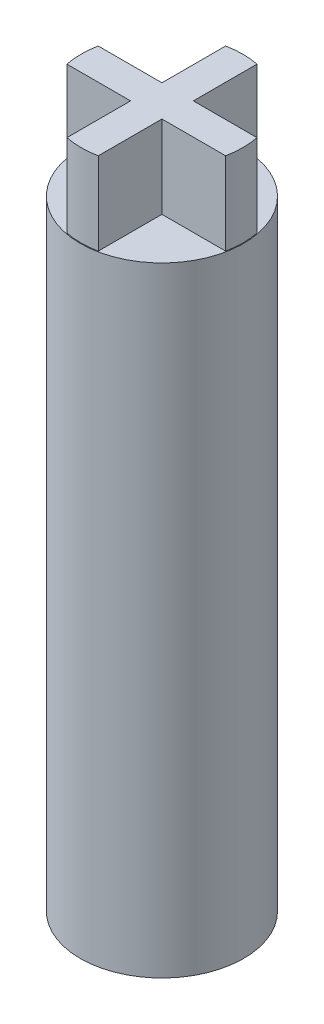
ISO-10303-21;
HEADER;
FILE_DESCRIPTION(('STEP AP214'),'2;1');
FILE_NAME('part.step','',(''),(''),'','','');
FILE_SCHEMA(('AUTOMOTIVE_DESIGN { 1 0 10303 214 1 1 1 1 }'));
ENDSEC;
DATA;
#1=APPLICATION_CONTEXT('core data for automotive mechanical design processes');
#2=APPLICATION_PROTOCOL_DEFINITION('international standard','automotive_design',2000,#1);
#3=PRODUCT_CONTEXT('',#1,'mechanical');
#4=PRODUCT('Part','Part','',(#3));
#5=PRODUCT_RELATED_PRODUCT_CATEGORY('part','',(#4));
#6=PRODUCT_DEFINITION_FORMATION('','',#4);
#7=PRODUCT_DEFINITION_CONTEXT('part definition',#1,'design');
#8=PRODUCT_DEFINITION('design','',#6,#7);
#9=PRODUCT_DEFINITION_SHAPE('','',#8);
#10=(LENGTH_UNIT() NAMED_UNIT(*) SI_UNIT(.MILLI.,.METRE.));
#11=(NAMED_UNIT(*) PLANE_ANGLE_UNIT() SI_UNIT($,.RADIAN.));
#12=(NAMED_UNIT(*) SI_UNIT($,.STERADIAN.) SOLID_ANGLE_UNIT());
#13=UNCERTAINTY_MEASURE_WITH_UNIT(LENGTH_MEASURE(1.E-05),#10,'distance_accuracy_value','');
#14=(GEOMETRIC_REPRESENTATION_CONTEXT(3) GLOBAL_UNCERTAINTY_ASSIGNED_CONTEXT((#13)) GLOBAL_UNIT_ASSIGNED_CONTEXT((#10,
#11,#12)) REPRESENTATION_CONTEXT('',''));
#15=CARTESIAN_POINT('',(0.,0.,0.));
#16=DIRECTION('',(0.,0.,1.));
#17=DIRECTION('',(1.,0.,0.));
#18=AXIS2_PLACEMENT_3D('',#15,#16,#17);
#19=CARTESIAN_POINT('',(0.,-75.,0.));
#20=DIRECTION('',(0.,1.,0.));
#21=DIRECTION('',(0.,0.,1.));
#22=AXIS2_PLACEMENT_3D('',#19,#20,#21);
#23=CYLINDRICAL_SURFACE('',#22,9.9);
#24=CARTESIAN_POINT('',(0.,-75.,0.));
#25=DIRECTION('',(0.,1.,0.));
#26=DIRECTION('',(0.,0.,1.));
#27=AXIS2_PLACEMENT_3D('',#24,#25,#26);
#28=CIRCLE('',#27,9.9);
#29=CARTESIAN_POINT('',(0.,-75.,9.9));
#30=VERTEX_POINT('',#29);
#31=EDGE_CURVE('E11',#30,#30,#28,.T.);
#32=ORIENTED_EDGE('',*,*,#31,.T.);
#33=EDGE_LOOP('',(#32));
#34=FACE_BOUND('',#33,.T.);
#35=CARTESIAN_POINT('',(0.,0.,0.));
#36=DIRECTION('',(0.,1.,0.));
#37=DIRECTION('',(0.,0.,1.));
#38=AXIS2_PLACEMENT_3D('',#35,#36,#37);
#39=CIRCLE('',#38,9.9);
#40=CARTESIAN_POINT('',(0.,0.,9.9));
#41=VERTEX_POINT('',#40);
#42=EDGE_CURVE('E44',#41,#41,#39,.T.);
#43=ORIENTED_EDGE('',*,*,#42,.F.);
#44=EDGE_LOOP('',(#43));
#45=FACE_BOUND('',#44,.T.);
#46=ADVANCED_FACE('F41',(#34,#45),#23,.T.);
#47=CARTESIAN_POINT('',(0.,-75.,0.));
#48=DIRECTION('',(0.,1.,0.));
#49=DIRECTION('',(0.,0.,1.));
#50=AXIS2_PLACEMENT_3D('',#47,#48,#49);
#51=PLANE('',#50);
#52=CARTESIAN_POINT('',(0.,-75.,0.));
#53=DIRECTION('',(0.,-1.,0.));
#54=DIRECTION('',(0.,0.,-1.));
#55=AXIS2_PLACEMENT_3D('',#52,#53,#54);
#56=CIRCLE('',#55,4.7);
#57=CARTESIAN_POINT('',(0.,-75.,-4.7));
#58=VERTEX_POINT('',#57);
#59=EDGE_CURVE('E258',#58,#58,#56,.T.);
#60=ORIENTED_EDGE('',*,*,#59,.F.);
#61=EDGE_LOOP('',(#60));
#62=FACE_BOUND('',#61,.T.);
#63=ORIENTED_EDGE('',*,*,#31,.F.);
#64=EDGE_LOOP('',(#63));
#65=FACE_BOUND('',#64,.T.);
#66=ADVANCED_FACE('F361',(#62,#65),#51,.F.);
#67=CARTESIAN_POINT('',(0.,0.,0.));
#68=DIRECTION('',(0.,1.,0.));
#69=DIRECTION('',(0.,0.,1.));
#70=AXIS2_PLACEMENT_3D('',#67,#68,#69);
#71=PLANE('',#70);
#72=ORIENTED_EDGE('',*,*,#42,.T.);
#73=EDGE_LOOP('',(#72));
#74=FACE_BOUND('',#73,.T.);
#75=CARTESIAN_POINT('',(0.,0.,0.));
#76=DIRECTION('',(0.,1.,0.));
#77=DIRECTION('',(0.,0.,1.));
#78=AXIS2_PLACEMENT_3D('',#75,#76,#77);
#79=CIRCLE('',#78,9.8);
#80=CARTESIAN_POINT('',(9.61405221537724,0.,1.89999999999999));
#81=VERTEX_POINT('',#80);
#82=CARTESIAN_POINT('',(9.61405221537724,0.,-1.90000000000001));
#83=VERTEX_POINT('',#82);
#84=EDGE_CURVE('E167',#81,#83,#79,.T.);
#85=ORIENTED_EDGE('',*,*,#84,.F.);
#86=DIRECTION('',(1.,0.,0.));
#87=VECTOR('',#86,1.);
#88=CARTESIAN_POINT('',(0.,0.,1.89999999999999));
#89=LINE('',#88,#87);
#90=CARTESIAN_POINT('',(1.9,0.,1.89999999999999));
#91=VERTEX_POINT('',#90);
#92=EDGE_CURVE('E155',#91,#81,#89,.T.);
#93=ORIENTED_EDGE('',*,*,#92,.F.);
#94=DIRECTION('',(0.,0.,1.));
#95=VECTOR('',#94,1.);
#96=CARTESIAN_POINT('',(1.9,0.,0.));
#97=LINE('',#96,#95);
#98=CARTESIAN_POINT('',(1.9,0.,9.61405221537724));
#99=VERTEX_POINT('',#98);
#100=EDGE_CURVE('E166',#91,#99,#97,.T.);
#101=ORIENTED_EDGE('',*,*,#100,.T.);
#102=CARTESIAN_POINT('',(0.,0.,0.));
#103=DIRECTION('',(0.,1.,0.));
#104=DIRECTION('',(0.,0.,1.));
#105=AXIS2_PLACEMENT_3D('',#102,#103,#104);
#106=CIRCLE('',#105,9.8);
#107=CARTESIAN_POINT('',(-1.9,0.,9.61405221537723));
#108=VERTEX_POINT('',#107);
#109=EDGE_CURVE('E188',#108,#99,#106,.T.);
#110=ORIENTED_EDGE('',*,*,#109,.F.);
#111=DIRECTION('',(0.,0.,1.));
#112=VECTOR('',#111,1.);
#113=CARTESIAN_POINT('',(-1.9,0.,0.));
#114=LINE('',#113,#112);
#115=CARTESIAN_POINT('',(-1.9,0.,1.89999999999999));
#116=VERTEX_POINT('',#115);
#117=EDGE_CURVE('E191',#116,#108,#114,.T.);
#118=ORIENTED_EDGE('',*,*,#117,.F.);
#119=DIRECTION('',(1.,0.,0.));
#120=VECTOR('',#119,1.);
#121=CARTESIAN_POINT('',(0.,0.,1.89999999999999));
#122=LINE('',#121,#120);
#123=CARTESIAN_POINT('',(-9.61405221537724,0.,1.89999999999999));
#124=VERTEX_POINT('',#123);
#125=EDGE_CURVE('E194',#124,#116,#122,.T.);
#126=ORIENTED_EDGE('',*,*,#125,.F.);
#127=CARTESIAN_POINT('',(0.,0.,0.));
#128=DIRECTION('',(0.,1.,0.));
#129=DIRECTION('',(0.,0.,1.));
#130=AXIS2_PLACEMENT_3D('',#127,#128,#129);
#131=CIRCLE('',#130,9.8);
#132=CARTESIAN_POINT('',(-9.61405221537724,0.,-1.90000000000001));
#133=VERTEX_POINT('',#132);
#134=EDGE_CURVE('E197',#133,#124,#131,.T.);
#135=ORIENTED_EDGE('',*,*,#134,.F.);
#136=DIRECTION('',(1.,0.,0.));
#137=VECTOR('',#136,1.);
#138=CARTESIAN_POINT('',(0.,0.,-1.90000000000001));
#139=LINE('',#138,#137);
#140=CARTESIAN_POINT('',(-1.9,0.,-1.90000000000001));
#141=VERTEX_POINT('',#140);
#142=EDGE_CURVE('E200',#133,#141,#139,.T.);
#143=ORIENTED_EDGE('',*,*,#142,.T.);
#144=DIRECTION('',(0.,0.,1.));
#145=VECTOR('',#144,1.);
#146=CARTESIAN_POINT('',(-1.9,0.,0.));
#147=LINE('',#146,#145);
#148=CARTESIAN_POINT('',(-1.9,0.,-9.61405221537724));
#149=VERTEX_POINT('',#148);
#150=EDGE_CURVE('E204',#149,#141,#147,.T.);
#151=ORIENTED_EDGE('',*,*,#150,.F.);
#152=CARTESIAN_POINT('',(0.,0.,0.));
#153=DIRECTION('',(0.,1.,0.));
#154=DIRECTION('',(0.,0.,1.));
#155=AXIS2_PLACEMENT_3D('',#152,#153,#154);
#156=CIRCLE('',#155,9.8);
#157=CARTESIAN_POINT('',(1.9,0.,-9.61405221537725));
#158=VERTEX_POINT('',#157);
#159=EDGE_CURVE('E207',#158,#149,#156,.T.);
#160=ORIENTED_EDGE('',*,*,#159,.F.);
#161=DIRECTION('',(0.,0.,1.));
#162=VECTOR('',#161,1.);
#163=CARTESIAN_POINT('',(1.9,0.,0.));
#164=LINE('',#163,#162);
#165=CARTESIAN_POINT('',(1.9,0.,-1.90000000000001));
#166=VERTEX_POINT('',#165);
#167=EDGE_CURVE('E210',#158,#166,#164,.T.);
#168=ORIENTED_EDGE('',*,*,#167,.T.);
#169=DIRECTION('',(1.,0.,0.));
#170=VECTOR('',#169,1.);
#171=CARTESIAN_POINT('',(0.,0.,-1.90000000000001));
#172=LINE('',#171,#170);
#173=EDGE_CURVE('E172',#166,#83,#172,.T.);
#174=ORIENTED_EDGE('',*,*,#173,.T.);
#175=EDGE_LOOP('',(#85,#93,#101,#110,#118,#126,#135,#143,#151,#160,#168,#174));
#176=FACE_BOUND('',#175,.T.);
#177=ADVANCED_FACE('F175',(#74,#176),#71,.T.);
#178=CARTESIAN_POINT('',(0.,-72.8,0.));
#179=DIRECTION('',(0.,-1.,0.));
#180=DIRECTION('',(0.,0.,-1.));
#181=AXIS2_PLACEMENT_3D('',#178,#179,#180);
#182=CYLINDRICAL_SURFACE('',#181,4.7);
#183=CARTESIAN_POINT('',(0.,-72.8,0.));
#184=DIRECTION('',(0.,-1.,0.));
#185=DIRECTION('',(0.,0.,-1.));
#186=AXIS2_PLACEMENT_3D('',#183,#184,#185);
#187=CIRCLE('',#186,4.7);
#188=CARTESIAN_POINT('',(0.,-72.8,-4.7));
#189=VERTEX_POINT('',#188);
#190=EDGE_CURVE('E292',#189,#189,#187,.T.);
#191=ORIENTED_EDGE('',*,*,#190,.F.);
#192=EDGE_LOOP('',(#191));
#193=FACE_BOUND('',#192,.T.);
#194=ORIENTED_EDGE('',*,*,#59,.T.);
#195=EDGE_LOOP('',(#194));
#196=FACE_BOUND('',#195,.T.);
#197=ADVANCED_FACE('F375',(#193,#196),#182,.F.);
#198=CARTESIAN_POINT('',(0.,-72.8,0.));
#199=DIRECTION('',(0.,-1.,0.));
#200=DIRECTION('',(0.,0.,-1.));
#201=AXIS2_PLACEMENT_3D('',#198,#199,#200);
#202=PLANE('',#201);
#203=CARTESIAN_POINT('',(0.,-72.8,0.));
#204=DIRECTION('',(0.,-1.,0.));
#205=DIRECTION('',(0.,0.,-1.));
#206=AXIS2_PLACEMENT_3D('',#203,#204,#205);
#207=CIRCLE('',#206,2.7);
#208=CARTESIAN_POINT('',(0.,-72.8,-2.7));
#209=VERTEX_POINT('',#208);
#210=EDGE_CURVE('E288',#209,#209,#207,.T.);
#211=ORIENTED_EDGE('',*,*,#210,.F.);
#212=EDGE_LOOP('',(#211));
#213=FACE_BOUND('',#212,.T.);
#214=ORIENTED_EDGE('',*,*,#190,.T.);
#215=EDGE_LOOP('',(#214));
#216=FACE_BOUND('',#215,.T.);
#217=ADVANCED_FACE('F379',(#213,#216),#202,.T.);
#218=CARTESIAN_POINT('',(0.,-70.8,0.));
#219=DIRECTION('',(0.,-1.,0.));
#220=DIRECTION('',(0.,0.,-1.));
#221=AXIS2_PLACEMENT_3D('',#218,#219,#220);
#222=PLANE('',#221);
#223=DIRECTION('',(0.,0.,1.));
#224=VECTOR('',#223,1.);
#225=CARTESIAN_POINT('',(-1.62,-70.8,0.));
#226=LINE('',#225,#224);
#227=CARTESIAN_POINT('',(-1.62,-70.8,-2.16));
#228=VERTEX_POINT('',#227);
#229=CARTESIAN_POINT('',(-1.62,-70.8,2.16));
#230=VERTEX_POINT('',#229);
#231=EDGE_CURVE('E300',#228,#230,#226,.T.);
#232=ORIENTED_EDGE('',*,*,#231,.T.);
#233=CARTESIAN_POINT('',(0.,-70.8,0.));
#234=DIRECTION('',(0.,-1.,0.));
#235=DIRECTION('',(0.,0.,-1.));
#236=AXIS2_PLACEMENT_3D('',#233,#234,#235);
#237=CIRCLE('',#236,2.7);
#238=EDGE_CURVE('E64',#230,#228,#237,.T.);
#239=ORIENTED_EDGE('',*,*,#238,.T.);
#240=EDGE_LOOP('',(#232,#239));
#241=FACE_BOUND('',#240,.T.);
#242=ADVANCED_FACE('F385',(#241),#222,.T.);
#243=CARTESIAN_POINT('',(-1.62,-64.8,0.));
#244=DIRECTION('',(1.,0.,0.));
#245=DIRECTION('',(0.,0.,-1.));
#246=AXIS2_PLACEMENT_3D('',#243,#244,#245);
#247=PLANE('',#246);
#248=DIRECTION('',(0.,-1.,0.));
#249=VECTOR('',#248,1.);
#250=CARTESIAN_POINT('',(-1.62,-64.8,2.16));
#251=LINE('',#250,#249);
#252=CARTESIAN_POINT('',(-1.62,-64.8,2.16));
#253=VERTEX_POINT('',#252);
#254=EDGE_CURVE('E334',#253,#230,#251,.T.);
#255=ORIENTED_EDGE('',*,*,#254,.T.);
#256=ORIENTED_EDGE('',*,*,#231,.F.);
#257=DIRECTION('',(0.,-1.,0.));
#258=VECTOR('',#257,1.);
#259=CARTESIAN_POINT('',(-1.62,-64.8,-2.16));
#260=LINE('',#259,#258);
#261=CARTESIAN_POINT('',(-1.62,-64.8,-2.16));
#262=VERTEX_POINT('',#261);
#263=EDGE_CURVE('E331',#262,#228,#260,.T.);
#264=ORIENTED_EDGE('',*,*,#263,.F.);
#265=DIRECTION('',(0.,0.,1.));
#266=VECTOR('',#265,1.);
#267=CARTESIAN_POINT('',(-1.62,-64.8,0.));
#268=LINE('',#267,#266);
#269=EDGE_CURVE('E319',#262,#253,#268,.T.);
#270=ORIENTED_EDGE('',*,*,#269,.T.);
#271=EDGE_LOOP('',(#255,#256,#264,#270));
#272=FACE_BOUND('',#271,.T.);
#273=ADVANCED_FACE('F383',(#272),#247,.T.);
#274=CARTESIAN_POINT('',(0.,-64.8,0.));
#275=DIRECTION('',(0.,-1.,0.));
#276=DIRECTION('',(0.,0.,-1.));
#277=AXIS2_PLACEMENT_3D('',#274,#275,#276);
#278=PLANE('',#277);
#279=DIRECTION('',(0.,0.,1.));
#280=VECTOR('',#279,1.);
#281=CARTESIAN_POINT('',(1.62,-64.8,0.));
#282=LINE('',#281,#280);
#283=CARTESIAN_POINT('',(1.62,-64.8,-2.16));
#284=VERTEX_POINT('',#283);
#285=CARTESIAN_POINT('',(1.62,-64.8,2.16));
#286=VERTEX_POINT('',#285);
#287=EDGE_CURVE('E306',#284,#286,#282,.T.);
#288=ORIENTED_EDGE('',*,*,#287,.T.);
#289=CARTESIAN_POINT('',(0.,-64.8,0.));
#290=DIRECTION('',(0.,-1.,0.));
#291=DIRECTION('',(0.,0.,-1.));
#292=AXIS2_PLACEMENT_3D('',#289,#290,#291);
#293=CIRCLE('',#292,2.7);
#294=EDGE_CURVE('E315',#286,#253,#293,.T.);
#295=ORIENTED_EDGE('',*,*,#294,.T.);
#296=ORIENTED_EDGE('',*,*,#269,.F.);
#297=CARTESIAN_POINT('',(0.,-64.8,0.));
#298=DIRECTION('',(0.,-1.,0.));
#299=DIRECTION('',(0.,0.,-1.));
#300=AXIS2_PLACEMENT_3D('',#297,#298,#299);
#301=CIRCLE('',#300,2.7);
#302=EDGE_CURVE('E322',#262,#284,#301,.T.);
#303=ORIENTED_EDGE('',*,*,#302,.T.);
#304=EDGE_LOOP('',(#288,#295,#296,#303));
#305=FACE_BOUND('',#304,.T.);
#306=ADVANCED_FACE('F356',(#305),#278,.T.);
#307=CARTESIAN_POINT('',(1.62,-64.8,0.));
#308=DIRECTION('',(1.,0.,0.));
#309=DIRECTION('',(0.,0.,-1.));
#310=AXIS2_PLACEMENT_3D('',#307,#308,#309);
#311=PLANE('',#310);
#312=DIRECTION('',(0.,0.,1.));
#313=VECTOR('',#312,1.);
#314=CARTESIAN_POINT('',(1.62,-70.8,0.));
#315=LINE('',#314,#313);
#316=CARTESIAN_POINT('',(1.62,-70.8,-2.16));
#317=VERTEX_POINT('',#316);
#318=CARTESIAN_POINT('',(1.62,-70.8,2.16));
#319=VERTEX_POINT('',#318);
#320=EDGE_CURVE('E296',#317,#319,#315,.T.);
#321=ORIENTED_EDGE('',*,*,#320,.T.);
#322=DIRECTION('',(0.,-1.,0.));
#323=VECTOR('',#322,1.);
#324=CARTESIAN_POINT('',(1.62,-64.8,2.16));
#325=LINE('',#324,#323);
#326=EDGE_CURVE('E326',#286,#319,#325,.T.);
#327=ORIENTED_EDGE('',*,*,#326,.F.);
#328=ORIENTED_EDGE('',*,*,#287,.F.);
#329=DIRECTION('',(0.,-1.,0.));
#330=VECTOR('',#329,1.);
#331=CARTESIAN_POINT('',(1.62,-64.8,-2.16));
#332=LINE('',#331,#330);
#333=EDGE_CURVE('E327',#284,#317,#332,.T.);
#334=ORIENTED_EDGE('',*,*,#333,.T.);
#335=EDGE_LOOP('',(#321,#327,#328,#334));
#336=FACE_BOUND('',#335,.T.);
#337=ADVANCED_FACE('F346',(#336),#311,.F.);
#338=CARTESIAN_POINT('',(0.,-70.8,0.));
#339=DIRECTION('',(0.,-1.,0.));
#340=DIRECTION('',(0.,0.,-1.));
#341=AXIS2_PLACEMENT_3D('',#338,#339,#340);
#342=PLANE('',#341);
#343=ORIENTED_EDGE('',*,*,#320,.F.);
#344=CARTESIAN_POINT('',(0.,-70.8,0.));
#345=DIRECTION('',(0.,-1.,0.));
#346=DIRECTION('',(0.,0.,-1.));
#347=AXIS2_PLACEMENT_3D('',#344,#345,#346);
#348=CIRCLE('',#347,2.7);
#349=EDGE_CURVE('E303',#317,#319,#348,.T.);
#350=ORIENTED_EDGE('',*,*,#349,.T.);
#351=EDGE_LOOP('',(#343,#350));
#352=FACE_BOUND('',#351,.T.);
#353=ADVANCED_FACE('F348',(#352),#342,.T.);
#354=CARTESIAN_POINT('',(0.,-64.8,0.));
#355=DIRECTION('',(0.,-1.,0.));
#356=DIRECTION('',(0.,0.,-1.));
#357=AXIS2_PLACEMENT_3D('',#354,#355,#356);
#358=CYLINDRICAL_SURFACE('',#357,2.7);
#359=ORIENTED_EDGE('',*,*,#349,.F.);
#360=ORIENTED_EDGE('',*,*,#333,.F.);
#361=ORIENTED_EDGE('',*,*,#302,.F.);
#362=ORIENTED_EDGE('',*,*,#263,.T.);
#363=ORIENTED_EDGE('',*,*,#238,.F.);
#364=ORIENTED_EDGE('',*,*,#254,.F.);
#365=ORIENTED_EDGE('',*,*,#294,.F.);
#366=ORIENTED_EDGE('',*,*,#326,.T.);
#367=EDGE_LOOP('',(#359,#360,#361,#362,#363,#364,#365,#366));
#368=FACE_BOUND('',#367,.T.);
#369=ORIENTED_EDGE('',*,*,#210,.T.);
#370=EDGE_LOOP('',(#369));
#371=FACE_BOUND('',#370,.T.);
#372=ADVANCED_FACE('F342',(#368,#371),#358,.F.);
#373=CARTESIAN_POINT('',(0.,0.,0.));
#374=DIRECTION('',(0.,1.,0.));
#375=DIRECTION('',(0.,0.,1.));
#376=AXIS2_PLACEMENT_3D('',#373,#374,#375);
#377=CYLINDRICAL_SURFACE('',#376,9.8);
#378=CARTESIAN_POINT('',(0.,10.,0.));
#379=DIRECTION('',(0.,1.,0.));
#380=DIRECTION('',(0.,0.,1.));
#381=AXIS2_PLACEMENT_3D('',#378,#379,#380);
#382=CIRCLE('',#381,9.8);
#383=CARTESIAN_POINT('',(9.61405221537724,10.,1.89999999999999));
#384=VERTEX_POINT('',#383);
#385=CARTESIAN_POINT('',(9.61405221537724,10.,-1.90000000000001));
#386=VERTEX_POINT('',#385);
#387=EDGE_CURVE('E56',#384,#386,#382,.T.);
#388=ORIENTED_EDGE('',*,*,#387,.F.);
#389=DIRECTION('',(0.,1.,0.));
#390=VECTOR('',#389,1.);
#391=CARTESIAN_POINT('',(9.61405221537724,0.,1.89999999999999));
#392=LINE('',#391,#390);
#393=EDGE_CURVE('E158',#81,#384,#392,.T.);
#394=ORIENTED_EDGE('',*,*,#393,.F.);
#395=ORIENTED_EDGE('',*,*,#84,.T.);
#396=DIRECTION('',(0.,1.,0.));
#397=VECTOR('',#396,1.);
#398=CARTESIAN_POINT('',(9.61405221537724,0.,-1.90000000000001));
#399=LINE('',#398,#397);
#400=EDGE_CURVE('E255',#83,#386,#399,.T.);
#401=ORIENTED_EDGE('',*,*,#400,.T.);
#402=EDGE_LOOP('',(#388,#394,#395,#401));
#403=FACE_BOUND('',#402,.T.);
#404=ADVANCED_FACE('F169',(#403),#377,.T.);
#405=CARTESIAN_POINT('',(0.,0.,-1.90000000000001));
#406=DIRECTION('',(0.,0.,1.));
#407=DIRECTION('',(1.,0.,0.));
#408=AXIS2_PLACEMENT_3D('',#405,#406,#407);
#409=PLANE('',#408);
#410=DIRECTION('',(1.,0.,0.));
#411=VECTOR('',#410,1.);
#412=CARTESIAN_POINT('',(0.,10.,-1.90000000000001));
#413=LINE('',#412,#411);
#414=CARTESIAN_POINT('',(1.9,10.,-1.90000000000001));
#415=VERTEX_POINT('',#414);
#416=EDGE_CURVE('E179',#415,#386,#413,.T.);
#417=ORIENTED_EDGE('',*,*,#416,.T.);
#418=ORIENTED_EDGE('',*,*,#400,.F.);
#419=ORIENTED_EDGE('',*,*,#173,.F.);
#420=DIRECTION('',(0.,1.,0.));
#421=VECTOR('',#420,1.);
#422=CARTESIAN_POINT('',(1.9,0.,-1.90000000000001));
#423=LINE('',#422,#421);
#424=EDGE_CURVE('E259',#166,#415,#423,.T.);
#425=ORIENTED_EDGE('',*,*,#424,.T.);
#426=EDGE_LOOP('',(#417,#418,#419,#425));
#427=FACE_BOUND('',#426,.T.);
#428=ADVANCED_FACE('F408',(#427),#409,.F.);
#429=CARTESIAN_POINT('',(1.9,0.,0.));
#430=DIRECTION('',(-1.,0.,0.));
#431=DIRECTION('',(0.,0.,1.));
#432=AXIS2_PLACEMENT_3D('',#429,#430,#431);
#433=PLANE('',#432);
#434=DIRECTION('',(0.,0.,1.));
#435=VECTOR('',#434,1.);
#436=CARTESIAN_POINT('',(1.9,10.,0.));
#437=LINE('',#436,#435);
#438=CARTESIAN_POINT('',(1.9,10.,-9.61405221537725));
#439=VERTEX_POINT('',#438);
#440=EDGE_CURVE('E183',#439,#415,#437,.T.);
#441=ORIENTED_EDGE('',*,*,#440,.T.);
#442=ORIENTED_EDGE('',*,*,#424,.F.);
#443=ORIENTED_EDGE('',*,*,#167,.F.);
#444=DIRECTION('',(0.,1.,0.));
#445=VECTOR('',#444,1.);
#446=CARTESIAN_POINT('',(1.9,0.,-9.61405221537725));
#447=LINE('',#446,#445);
#448=EDGE_CURVE('E262',#158,#439,#447,.T.);
#449=ORIENTED_EDGE('',*,*,#448,.T.);
#450=EDGE_LOOP('',(#441,#442,#443,#449));
#451=FACE_BOUND('',#450,.T.);
#452=ADVANCED_FACE('F442',(#451),#433,.F.);
#453=CARTESIAN_POINT('',(0.,0.,0.));
#454=DIRECTION('',(0.,1.,0.));
#455=DIRECTION('',(0.,0.,1.));
#456=AXIS2_PLACEMENT_3D('',#453,#454,#455);
#457=CYLINDRICAL_SURFACE('',#456,9.8);
#458=CARTESIAN_POINT('',(0.,10.,0.));
#459=DIRECTION('',(0.,1.,0.));
#460=DIRECTION('',(0.,0.,1.));
#461=AXIS2_PLACEMENT_3D('',#458,#459,#460);
#462=CIRCLE('',#461,9.8);
#463=CARTESIAN_POINT('',(-1.9,10.,-9.61405221537724));
#464=VERTEX_POINT('',#463);
#465=EDGE_CURVE('E248',#439,#464,#462,.T.);
#466=ORIENTED_EDGE('',*,*,#465,.F.);
#467=ORIENTED_EDGE('',*,*,#448,.F.);
#468=ORIENTED_EDGE('',*,*,#159,.T.);
#469=DIRECTION('',(0.,1.,0.));
#470=VECTOR('',#469,1.);
#471=CARTESIAN_POINT('',(-1.9,0.,-9.61405221537724));
#472=LINE('',#471,#470);
#473=EDGE_CURVE('E265',#149,#464,#472,.T.);
#474=ORIENTED_EDGE('',*,*,#473,.T.);
#475=EDGE_LOOP('',(#466,#467,#468,#474));
#476=FACE_BOUND('',#475,.T.);
#477=ADVANCED_FACE('F438',(#476),#457,.T.);
#478=CARTESIAN_POINT('',(-1.9,0.,0.));
#479=DIRECTION('',(-1.,0.,0.));
#480=DIRECTION('',(0.,0.,1.));
#481=AXIS2_PLACEMENT_3D('',#478,#479,#480);
#482=PLANE('',#481);
#483=DIRECTION('',(0.,0.,1.));
#484=VECTOR('',#483,1.);
#485=CARTESIAN_POINT('',(-1.9,10.,0.));
#486=LINE('',#485,#484);
#487=CARTESIAN_POINT('',(-1.9,10.,-1.90000000000001));
#488=VERTEX_POINT('',#487);
#489=EDGE_CURVE('E244',#464,#488,#486,.T.);
#490=ORIENTED_EDGE('',*,*,#489,.F.);
#491=ORIENTED_EDGE('',*,*,#473,.F.);
#492=ORIENTED_EDGE('',*,*,#150,.T.);
#493=DIRECTION('',(0.,1.,0.));
#494=VECTOR('',#493,1.);
#495=CARTESIAN_POINT('',(-1.9,0.,-1.90000000000001));
#496=LINE('',#495,#494);
#497=EDGE_CURVE('E268',#141,#488,#496,.T.);
#498=ORIENTED_EDGE('',*,*,#497,.T.);
#499=EDGE_LOOP('',(#490,#491,#492,#498));
#500=FACE_BOUND('',#499,.T.);
#501=ADVANCED_FACE('F434',(#500),#482,.T.);
#502=CARTESIAN_POINT('',(0.,0.,-1.90000000000001));
#503=DIRECTION('',(0.,0.,1.));
#504=DIRECTION('',(1.,0.,0.));
#505=AXIS2_PLACEMENT_3D('',#502,#503,#504);
#506=PLANE('',#505);
#507=DIRECTION('',(1.,0.,0.));
#508=VECTOR('',#507,1.);
#509=CARTESIAN_POINT('',(0.,10.,-1.90000000000001));
#510=LINE('',#509,#508);
#511=CARTESIAN_POINT('',(-9.61405221537724,10.,-1.90000000000001));
#512=VERTEX_POINT('',#511);
#513=EDGE_CURVE('E240',#512,#488,#510,.T.);
#514=ORIENTED_EDGE('',*,*,#513,.T.);
#515=ORIENTED_EDGE('',*,*,#497,.F.);
#516=ORIENTED_EDGE('',*,*,#142,.F.);
#517=DIRECTION('',(0.,1.,0.));
#518=VECTOR('',#517,1.);
#519=CARTESIAN_POINT('',(-9.61405221537724,0.,-1.90000000000001));
#520=LINE('',#519,#518);
#521=EDGE_CURVE('E271',#133,#512,#520,.T.);
#522=ORIENTED_EDGE('',*,*,#521,.T.);
#523=EDGE_LOOP('',(#514,#515,#516,#522));
#524=FACE_BOUND('',#523,.T.);
#525=ADVANCED_FACE('F430',(#524),#506,.F.);
#526=CARTESIAN_POINT('',(0.,0.,0.));
#527=DIRECTION('',(0.,1.,0.));
#528=DIRECTION('',(0.,0.,1.));
#529=AXIS2_PLACEMENT_3D('',#526,#527,#528);
#530=CYLINDRICAL_SURFACE('',#529,9.8);
#531=CARTESIAN_POINT('',(0.,10.,0.));
#532=DIRECTION('',(0.,1.,0.));
#533=DIRECTION('',(0.,0.,1.));
#534=AXIS2_PLACEMENT_3D('',#531,#532,#533);
#535=CIRCLE('',#534,9.8);
#536=CARTESIAN_POINT('',(-9.61405221537724,10.,1.89999999999999));
#537=VERTEX_POINT('',#536);
#538=EDGE_CURVE('E236',#512,#537,#535,.T.);
#539=ORIENTED_EDGE('',*,*,#538,.F.);
#540=ORIENTED_EDGE('',*,*,#521,.F.);
#541=ORIENTED_EDGE('',*,*,#134,.T.);
#542=DIRECTION('',(0.,1.,0.));
#543=VECTOR('',#542,1.);
#544=CARTESIAN_POINT('',(-9.61405221537724,0.,1.89999999999999));
#545=LINE('',#544,#543);
#546=EDGE_CURVE('E274',#124,#537,#545,.T.);
#547=ORIENTED_EDGE('',*,*,#546,.T.);
#548=EDGE_LOOP('',(#539,#540,#541,#547));
#549=FACE_BOUND('',#548,.T.);
#550=ADVANCED_FACE('F426',(#549),#530,.T.);
#551=CARTESIAN_POINT('',(0.,0.,1.89999999999999));
#552=DIRECTION('',(0.,0.,1.));
#553=DIRECTION('',(1.,0.,0.));
#554=AXIS2_PLACEMENT_3D('',#551,#552,#553);
#555=PLANE('',#554);
#556=DIRECTION('',(1.,0.,0.));
#557=VECTOR('',#556,1.);
#558=CARTESIAN_POINT('',(0.,10.,1.89999999999999));
#559=LINE('',#558,#557);
#560=CARTESIAN_POINT('',(-1.9,10.,1.89999999999999));
#561=VERTEX_POINT('',#560);
#562=EDGE_CURVE('E232',#537,#561,#559,.T.);
#563=ORIENTED_EDGE('',*,*,#562,.F.);
#564=ORIENTED_EDGE('',*,*,#546,.F.);
#565=ORIENTED_EDGE('',*,*,#125,.T.);
#566=DIRECTION('',(0.,1.,0.));
#567=VECTOR('',#566,1.);
#568=CARTESIAN_POINT('',(-1.9,0.,1.89999999999999));
#569=LINE('',#568,#567);
#570=EDGE_CURVE('E277',#116,#561,#569,.T.);
#571=ORIENTED_EDGE('',*,*,#570,.T.);
#572=EDGE_LOOP('',(#563,#564,#565,#571));
#573=FACE_BOUND('',#572,.T.);
#574=ADVANCED_FACE('F422',(#573),#555,.T.);
#575=CARTESIAN_POINT('',(-1.9,0.,0.));
#576=DIRECTION('',(-1.,0.,0.));
#577=DIRECTION('',(0.,0.,1.));
#578=AXIS2_PLACEMENT_3D('',#575,#576,#577);
#579=PLANE('',#578);
#580=DIRECTION('',(0.,0.,1.));
#581=VECTOR('',#580,1.);
#582=CARTESIAN_POINT('',(-1.9,10.,0.));
#583=LINE('',#582,#581);
#584=CARTESIAN_POINT('',(-1.9,10.,9.61405221537723));
#585=VERTEX_POINT('',#584);
#586=EDGE_CURVE('E228',#561,#585,#583,.T.);
#587=ORIENTED_EDGE('',*,*,#586,.F.);
#588=ORIENTED_EDGE('',*,*,#570,.F.);
#589=ORIENTED_EDGE('',*,*,#117,.T.);
#590=DIRECTION('',(0.,1.,0.));
#591=VECTOR('',#590,1.);
#592=CARTESIAN_POINT('',(-1.9,0.,9.61405221537723));
#593=LINE('',#592,#591);
#594=EDGE_CURVE('E280',#108,#585,#593,.T.);
#595=ORIENTED_EDGE('',*,*,#594,.T.);
#596=EDGE_LOOP('',(#587,#588,#589,#595));
#597=FACE_BOUND('',#596,.T.);
#598=ADVANCED_FACE('F418',(#597),#579,.T.);
#599=CARTESIAN_POINT('',(0.,0.,0.));
#600=DIRECTION('',(0.,1.,0.));
#601=DIRECTION('',(0.,0.,1.));
#602=AXIS2_PLACEMENT_3D('',#599,#600,#601);
#603=CYLINDRICAL_SURFACE('',#602,9.8);
#604=CARTESIAN_POINT('',(0.,10.,0.));
#605=DIRECTION('',(0.,1.,0.));
#606=DIRECTION('',(0.,0.,1.));
#607=AXIS2_PLACEMENT_3D('',#604,#605,#606);
#608=CIRCLE('',#607,9.8);
#609=CARTESIAN_POINT('',(1.9,10.,9.61405221537724));
#610=VERTEX_POINT('',#609);
#611=EDGE_CURVE('E224',#585,#610,#608,.T.);
#612=ORIENTED_EDGE('',*,*,#611,.F.);
#613=ORIENTED_EDGE('',*,*,#594,.F.);
#614=ORIENTED_EDGE('',*,*,#109,.T.);
#615=DIRECTION('',(0.,1.,0.));
#616=VECTOR('',#615,1.);
#617=CARTESIAN_POINT('',(1.9,0.,9.61405221537724));
#618=LINE('',#617,#616);
#619=EDGE_CURVE('E283',#99,#610,#618,.T.);
#620=ORIENTED_EDGE('',*,*,#619,.T.);
#621=EDGE_LOOP('',(#612,#613,#614,#620));
#622=FACE_BOUND('',#621,.T.);
#623=ADVANCED_FACE('F414',(#622),#603,.T.);
#624=CARTESIAN_POINT('',(1.9,0.,0.));
#625=DIRECTION('',(-1.,0.,0.));
#626=DIRECTION('',(0.,0.,1.));
#627=AXIS2_PLACEMENT_3D('',#624,#625,#626);
#628=PLANE('',#627);
#629=DIRECTION('',(0.,0.,1.));
#630=VECTOR('',#629,1.);
#631=CARTESIAN_POINT('',(1.9,10.,0.));
#632=LINE('',#631,#630);
#633=CARTESIAN_POINT('',(1.9,10.,1.89999999999999));
#634=VERTEX_POINT('',#633);
#635=EDGE_CURVE('E220',#634,#610,#632,.T.);
#636=ORIENTED_EDGE('',*,*,#635,.T.);
#637=ORIENTED_EDGE('',*,*,#619,.F.);
#638=ORIENTED_EDGE('',*,*,#100,.F.);
#639=DIRECTION('',(0.,1.,0.));
#640=VECTOR('',#639,1.);
#641=CARTESIAN_POINT('',(1.9,0.,1.89999999999999));
#642=LINE('',#641,#640);
#643=EDGE_CURVE('E160',#91,#634,#642,.T.);
#644=ORIENTED_EDGE('',*,*,#643,.T.);
#645=EDGE_LOOP('',(#636,#637,#638,#644));
#646=FACE_BOUND('',#645,.T.);
#647=ADVANCED_FACE('F411',(#646),#628,.F.);
#648=CARTESIAN_POINT('',(0.,0.,1.89999999999999));
#649=DIRECTION('',(0.,0.,1.));
#650=DIRECTION('',(1.,0.,0.));
#651=AXIS2_PLACEMENT_3D('',#648,#649,#650);
#652=PLANE('',#651);
#653=DIRECTION('',(1.,0.,0.));
#654=VECTOR('',#653,1.);
#655=CARTESIAN_POINT('',(0.,10.,1.89999999999999));
#656=LINE('',#655,#654);
#657=EDGE_CURVE('E217',#634,#384,#656,.T.);
#658=ORIENTED_EDGE('',*,*,#657,.F.);
#659=ORIENTED_EDGE('',*,*,#643,.F.);
#660=ORIENTED_EDGE('',*,*,#92,.T.);
#661=ORIENTED_EDGE('',*,*,#393,.T.);
#662=EDGE_LOOP('',(#658,#659,#660,#661));
#663=FACE_BOUND('',#662,.T.);
#664=ADVANCED_FACE('F157',(#663),#652,.T.);
#665=CARTESIAN_POINT('',(0.,10.,0.));
#666=DIRECTION('',(0.,1.,0.));
#667=DIRECTION('',(0.,0.,1.));
#668=AXIS2_PLACEMENT_3D('',#665,#666,#667);
#669=PLANE('',#668);
#670=ORIENTED_EDGE('',*,*,#657,.T.);
#671=ORIENTED_EDGE('',*,*,#387,.T.);
#672=ORIENTED_EDGE('',*,*,#416,.F.);
#673=ORIENTED_EDGE('',*,*,#440,.F.);
#674=ORIENTED_EDGE('',*,*,#465,.T.);
#675=ORIENTED_EDGE('',*,*,#489,.T.);
#676=ORIENTED_EDGE('',*,*,#513,.F.);
#677=ORIENTED_EDGE('',*,*,#538,.T.);
#678=ORIENTED_EDGE('',*,*,#562,.T.);
#679=ORIENTED_EDGE('',*,*,#586,.T.);
#680=ORIENTED_EDGE('',*,*,#611,.T.);
#681=ORIENTED_EDGE('',*,*,#635,.F.);
#682=EDGE_LOOP('',(#670,#671,#672,#673,#674,#675,#676,#677,#678,#679,#680,#681));
#683=FACE_BOUND('',#682,.T.);
#684=ADVANCED_FACE('F402',(#683),#669,.T.);
#685=CLOSED_SHELL('',(#46,#66,#177,#197,#217,#242,#273,#306,#337,#353,#372,#404,#428,#452,#477,
#501,#525,#550,#574,#598,#623,#647,#664,#684));
#686=MANIFOLD_SOLID_BREP('B2',#685);
#687=ADVANCED_BREP_SHAPE_REPRESENTATION('',(#18,#686),#14);
#688=SHAPE_DEFINITION_REPRESENTATION(#9,#687);
ENDSEC;
END-ISO-10303-21;
